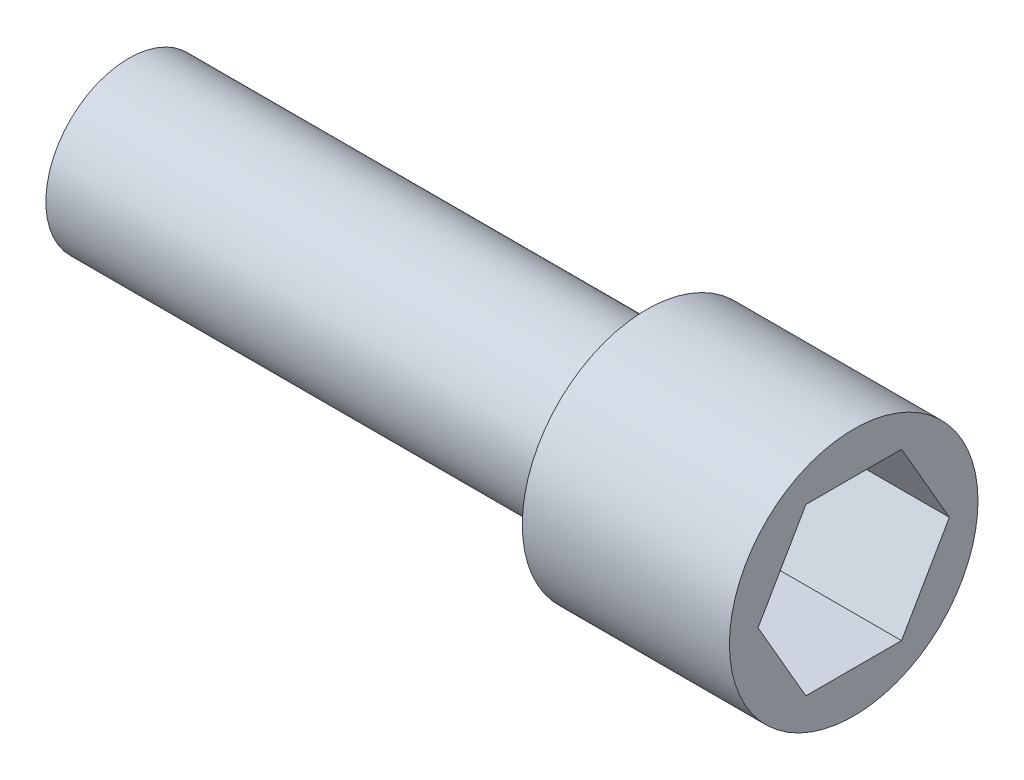
ISO-10303-21;
HEADER;
FILE_DESCRIPTION(('STEP AP214'),'2;1');
FILE_NAME('part.step','',(''),(''),'','','');
FILE_SCHEMA(('AUTOMOTIVE_DESIGN { 1 0 10303 214 1 1 1 1 }'));
ENDSEC;
DATA;
#1=APPLICATION_CONTEXT('core data for automotive mechanical design processes');
#2=APPLICATION_PROTOCOL_DEFINITION('international standard','automotive_design',2000,#1);
#3=PRODUCT_CONTEXT('',#1,'mechanical');
#4=PRODUCT('Part','Part','',(#3));
#5=PRODUCT_RELATED_PRODUCT_CATEGORY('part','',(#4));
#6=PRODUCT_DEFINITION_FORMATION('','',#4);
#7=PRODUCT_DEFINITION_CONTEXT('part definition',#1,'design');
#8=PRODUCT_DEFINITION('design','',#6,#7);
#9=PRODUCT_DEFINITION_SHAPE('','',#8);
#10=(LENGTH_UNIT() NAMED_UNIT(*) SI_UNIT(.MILLI.,.METRE.));
#11=(NAMED_UNIT(*) PLANE_ANGLE_UNIT() SI_UNIT($,.RADIAN.));
#12=(NAMED_UNIT(*) SI_UNIT($,.STERADIAN.) SOLID_ANGLE_UNIT());
#13=UNCERTAINTY_MEASURE_WITH_UNIT(LENGTH_MEASURE(1.E-05),#10,'distance_accuracy_value','');
#14=(GEOMETRIC_REPRESENTATION_CONTEXT(3) GLOBAL_UNCERTAINTY_ASSIGNED_CONTEXT((#13)) GLOBAL_UNIT_ASSIGNED_CONTEXT((#10,
#11,#12)) REPRESENTATION_CONTEXT('',''));
#15=CARTESIAN_POINT('',(0.,0.,0.));
#16=DIRECTION('',(0.,0.,1.));
#17=DIRECTION('',(1.,0.,0.));
#18=AXIS2_PLACEMENT_3D('',#15,#16,#17);
#19=CARTESIAN_POINT('',(0.,0.,0.));
#20=DIRECTION('',(-1.,0.,0.));
#21=DIRECTION('',(0.,0.,1.));
#22=AXIS2_PLACEMENT_3D('',#19,#20,#21);
#23=PLANE('',#22);
#24=CARTESIAN_POINT('',(0.,0.,0.));
#25=DIRECTION('',(1.,0.,0.));
#26=DIRECTION('',(0.,0.,-1.));
#27=AXIS2_PLACEMENT_3D('',#24,#25,#26);
#28=CIRCLE('',#27,4.);
#29=CARTESIAN_POINT('',(0.,0.,-4.));
#30=VERTEX_POINT('',#29);
#31=EDGE_CURVE('E11',#30,#30,#28,.T.);
#32=ORIENTED_EDGE('',*,*,#31,.F.);
#33=EDGE_LOOP('',(#32));
#34=FACE_BOUND('',#33,.T.);
#35=ADVANCED_FACE('F41',(#34),#23,.T.);
#36=CARTESIAN_POINT('',(35.,0.,0.));
#37=DIRECTION('',(1.,0.,0.));
#38=DIRECTION('',(0.,0.,-1.));
#39=AXIS2_PLACEMENT_3D('',#36,#37,#38);
#40=CYLINDRICAL_SURFACE('',#39,4.);
#41=ORIENTED_EDGE('',*,*,#31,.T.);
#42=EDGE_LOOP('',(#41));
#43=FACE_BOUND('',#42,.T.);
#44=CARTESIAN_POINT('',(25.,0.,0.));
#45=DIRECTION('',(1.,0.,0.));
#46=DIRECTION('',(0.,0.,-1.));
#47=AXIS2_PLACEMENT_3D('',#44,#45,#46);
#48=CIRCLE('',#47,4.);
#49=CARTESIAN_POINT('',(25.,0.,-4.));
#50=VERTEX_POINT('',#49);
#51=EDGE_CURVE('E48',#50,#50,#48,.T.);
#52=ORIENTED_EDGE('',*,*,#51,.F.);
#53=EDGE_LOOP('',(#52));
#54=FACE_BOUND('',#53,.T.);
#55=ADVANCED_FACE('F156',(#43,#54),#40,.T.);
#56=CARTESIAN_POINT('',(25.,4.,0.));
#57=DIRECTION('',(-1.,0.,0.));
#58=DIRECTION('',(0.,0.,1.));
#59=AXIS2_PLACEMENT_3D('',#56,#57,#58);
#60=PLANE('',#59);
#61=ORIENTED_EDGE('',*,*,#51,.T.);
#62=EDGE_LOOP('',(#61));
#63=FACE_BOUND('',#62,.T.);
#64=CARTESIAN_POINT('',(25.,0.,0.));
#65=DIRECTION('',(1.,0.,0.));
#66=DIRECTION('',(0.,0.,-1.));
#67=AXIS2_PLACEMENT_3D('',#64,#65,#66);
#68=CIRCLE('',#67,6.);
#69=CARTESIAN_POINT('',(25.,0.,-6.));
#70=VERTEX_POINT('',#69);
#71=EDGE_CURVE('E148',#70,#70,#68,.T.);
#72=ORIENTED_EDGE('',*,*,#71,.F.);
#73=EDGE_LOOP('',(#72));
#74=FACE_BOUND('',#73,.T.);
#75=ADVANCED_FACE('F154',(#63,#74),#60,.T.);
#76=CARTESIAN_POINT('',(35.,0.,0.));
#77=DIRECTION('',(1.,0.,0.));
#78=DIRECTION('',(0.,0.,-1.));
#79=AXIS2_PLACEMENT_3D('',#76,#77,#78);
#80=CYLINDRICAL_SURFACE('',#79,6.);
#81=ORIENTED_EDGE('',*,*,#71,.T.);
#82=EDGE_LOOP('',(#81));
#83=FACE_BOUND('',#82,.T.);
#84=CARTESIAN_POINT('',(35.,0.,0.));
#85=DIRECTION('',(1.,0.,0.));
#86=DIRECTION('',(0.,0.,-1.));
#87=AXIS2_PLACEMENT_3D('',#84,#85,#86);
#88=CIRCLE('',#87,6.);
#89=CARTESIAN_POINT('',(35.,0.,-6.));
#90=VERTEX_POINT('',#89);
#91=EDGE_CURVE('E145',#90,#90,#88,.T.);
#92=ORIENTED_EDGE('',*,*,#91,.F.);
#93=EDGE_LOOP('',(#92));
#94=FACE_BOUND('',#93,.T.);
#95=ADVANCED_FACE('F164',(#83,#94),#80,.T.);
#96=CARTESIAN_POINT('',(35.,6.,0.));
#97=DIRECTION('',(1.,0.,0.));
#98=DIRECTION('',(0.,0.,-1.));
#99=AXIS2_PLACEMENT_3D('',#96,#97,#98);
#100=PLANE('',#99);
#101=DIRECTION('',(0.,0.866025403784438,-0.5));
#102=VECTOR('',#101,1.);
#103=CARTESIAN_POINT('',(35.,-4.,-2.3094010767585));
#104=LINE('',#103,#102);
#105=CARTESIAN_POINT('',(35.,-4.,-2.3094010767585));
#106=VERTEX_POINT('',#105);
#107=CARTESIAN_POINT('',(35.,0.,-4.61880215351701));
#108=VERTEX_POINT('',#107);
#109=EDGE_CURVE('E54',#106,#108,#104,.T.);
#110=ORIENTED_EDGE('',*,*,#109,.F.);
#111=DIRECTION('',(0.,0.,-1.));
#112=VECTOR('',#111,1.);
#113=CARTESIAN_POINT('',(35.,-4.,2.3094010767585));
#114=LINE('',#113,#112);
#115=CARTESIAN_POINT('',(35.,-4.,2.3094010767585));
#116=VERTEX_POINT('',#115);
#117=EDGE_CURVE('E138',#116,#106,#114,.T.);
#118=ORIENTED_EDGE('',*,*,#117,.F.);
#119=DIRECTION('',(0.,-0.866025403784438,-0.5));
#120=VECTOR('',#119,1.);
#121=CARTESIAN_POINT('',(35.,0.,4.61880215351701));
#122=LINE('',#121,#120);
#123=CARTESIAN_POINT('',(35.,0.,4.61880215351701));
#124=VERTEX_POINT('',#123);
#125=EDGE_CURVE('E136',#124,#116,#122,.T.);
#126=ORIENTED_EDGE('',*,*,#125,.F.);
#127=DIRECTION('',(0.,-0.866025403784438,0.5));
#128=VECTOR('',#127,1.);
#129=CARTESIAN_POINT('',(35.,4.,2.3094010767585));
#130=LINE('',#129,#128);
#131=CARTESIAN_POINT('',(35.,4.,2.3094010767585));
#132=VERTEX_POINT('',#131);
#133=EDGE_CURVE('E104',#132,#124,#130,.T.);
#134=ORIENTED_EDGE('',*,*,#133,.F.);
#135=DIRECTION('',(0.,0.,1.));
#136=VECTOR('',#135,1.);
#137=CARTESIAN_POINT('',(35.,4.,-2.3094010767585));
#138=LINE('',#137,#136);
#139=CARTESIAN_POINT('',(35.,4.,-2.3094010767585));
#140=VERTEX_POINT('',#139);
#141=EDGE_CURVE('E135',#140,#132,#138,.T.);
#142=ORIENTED_EDGE('',*,*,#141,.F.);
#143=DIRECTION('',(0.,0.866025403784438,0.5));
#144=VECTOR('',#143,1.);
#145=CARTESIAN_POINT('',(35.,0.,-4.61880215351701));
#146=LINE('',#145,#144);
#147=EDGE_CURVE('E129',#108,#140,#146,.T.);
#148=ORIENTED_EDGE('',*,*,#147,.F.);
#149=EDGE_LOOP('',(#110,#118,#126,#134,#142,#148));
#150=FACE_BOUND('',#149,.T.);
#151=ORIENTED_EDGE('',*,*,#91,.T.);
#152=EDGE_LOOP('',(#151));
#153=FACE_BOUND('',#152,.T.);
#154=ADVANCED_FACE('F173',(#150,#153),#100,.T.);
#155=CARTESIAN_POINT('',(28.,-4.,-2.3094010767585));
#156=DIRECTION('',(0.,-0.5,-0.866025403784438));
#157=DIRECTION('',(0.,0.866025403784439,-0.5));
#158=AXIS2_PLACEMENT_3D('',#155,#156,#157);
#159=PLANE('',#158);
#160=ORIENTED_EDGE('',*,*,#109,.T.);
#161=DIRECTION('',(1.,0.,0.));
#162=VECTOR('',#161,1.);
#163=CARTESIAN_POINT('',(28.,0.,-4.61880215351701));
#164=LINE('',#163,#162);
#165=CARTESIAN_POINT('',(28.,0.,-4.61880215351701));
#166=VERTEX_POINT('',#165);
#167=EDGE_CURVE('E82',#166,#108,#164,.T.);
#168=ORIENTED_EDGE('',*,*,#167,.F.);
#169=DIRECTION('',(0.,0.866025403784438,-0.5));
#170=VECTOR('',#169,1.);
#171=CARTESIAN_POINT('',(28.,-4.,-2.3094010767585));
#172=LINE('',#171,#170);
#173=CARTESIAN_POINT('',(28.,-4.,-2.3094010767585));
#174=VERTEX_POINT('',#173);
#175=EDGE_CURVE('E139',#174,#166,#172,.T.);
#176=ORIENTED_EDGE('',*,*,#175,.F.);
#177=DIRECTION('',(1.,0.,0.));
#178=VECTOR('',#177,1.);
#179=CARTESIAN_POINT('',(28.,-4.,-2.3094010767585));
#180=LINE('',#179,#178);
#181=EDGE_CURVE('E61',#174,#106,#180,.T.);
#182=ORIENTED_EDGE('',*,*,#181,.T.);
#183=EDGE_LOOP('',(#160,#168,#176,#182));
#184=FACE_BOUND('',#183,.T.);
#185=ADVANCED_FACE('F172',(#184),#159,.F.);
#186=CARTESIAN_POINT('',(28.,-4.,2.3094010767585));
#187=DIRECTION('',(0.,-1.,0.));
#188=DIRECTION('',(0.,0.,-1.));
#189=AXIS2_PLACEMENT_3D('',#186,#187,#188);
#190=PLANE('',#189);
#191=ORIENTED_EDGE('',*,*,#117,.T.);
#192=ORIENTED_EDGE('',*,*,#181,.F.);
#193=DIRECTION('',(0.,0.,-1.));
#194=VECTOR('',#193,1.);
#195=CARTESIAN_POINT('',(28.,-4.,2.3094010767585));
#196=LINE('',#195,#194);
#197=CARTESIAN_POINT('',(28.,-4.,2.3094010767585));
#198=VERTEX_POINT('',#197);
#199=EDGE_CURVE('E113',#198,#174,#196,.T.);
#200=ORIENTED_EDGE('',*,*,#199,.F.);
#201=DIRECTION('',(1.,0.,0.));
#202=VECTOR('',#201,1.);
#203=CARTESIAN_POINT('',(28.,-4.,2.3094010767585));
#204=LINE('',#203,#202);
#205=EDGE_CURVE('E110',#198,#116,#204,.T.);
#206=ORIENTED_EDGE('',*,*,#205,.T.);
#207=EDGE_LOOP('',(#191,#192,#200,#206));
#208=FACE_BOUND('',#207,.T.);
#209=ADVANCED_FACE('F177',(#208),#190,.F.);
#210=CARTESIAN_POINT('',(28.,0.,4.61880215351701));
#211=DIRECTION('',(0.,-0.5,0.866025403784438));
#212=DIRECTION('',(0.,-0.866025403784439,-0.5));
#213=AXIS2_PLACEMENT_3D('',#210,#211,#212);
#214=PLANE('',#213);
#215=ORIENTED_EDGE('',*,*,#125,.T.);
#216=ORIENTED_EDGE('',*,*,#205,.F.);
#217=DIRECTION('',(0.,-0.866025403784438,-0.5));
#218=VECTOR('',#217,1.);
#219=CARTESIAN_POINT('',(28.,0.,4.61880215351701));
#220=LINE('',#219,#218);
#221=CARTESIAN_POINT('',(28.,0.,4.61880215351701));
#222=VERTEX_POINT('',#221);
#223=EDGE_CURVE('E112',#222,#198,#220,.T.);
#224=ORIENTED_EDGE('',*,*,#223,.F.);
#225=DIRECTION('',(1.,0.,0.));
#226=VECTOR('',#225,1.);
#227=CARTESIAN_POINT('',(28.,0.,4.61880215351701));
#228=LINE('',#227,#226);
#229=EDGE_CURVE('E96',#222,#124,#228,.T.);
#230=ORIENTED_EDGE('',*,*,#229,.T.);
#231=EDGE_LOOP('',(#215,#216,#224,#230));
#232=FACE_BOUND('',#231,.T.);
#233=ADVANCED_FACE('F115',(#232),#214,.F.);
#234=CARTESIAN_POINT('',(28.,4.,2.3094010767585));
#235=DIRECTION('',(0.,0.5,0.866025403784438));
#236=DIRECTION('',(0.,-0.866025403784439,0.5));
#237=AXIS2_PLACEMENT_3D('',#234,#235,#236);
#238=PLANE('',#237);
#239=ORIENTED_EDGE('',*,*,#133,.T.);
#240=ORIENTED_EDGE('',*,*,#229,.F.);
#241=DIRECTION('',(0.,-0.866025403784438,0.5));
#242=VECTOR('',#241,1.);
#243=CARTESIAN_POINT('',(28.,4.,2.3094010767585));
#244=LINE('',#243,#242);
#245=CARTESIAN_POINT('',(28.,4.,2.3094010767585));
#246=VERTEX_POINT('',#245);
#247=EDGE_CURVE('E99',#246,#222,#244,.T.);
#248=ORIENTED_EDGE('',*,*,#247,.F.);
#249=DIRECTION('',(1.,0.,0.));
#250=VECTOR('',#249,1.);
#251=CARTESIAN_POINT('',(28.,4.,2.3094010767585));
#252=LINE('',#251,#250);
#253=EDGE_CURVE('E106',#246,#132,#252,.T.);
#254=ORIENTED_EDGE('',*,*,#253,.T.);
#255=EDGE_LOOP('',(#239,#240,#248,#254));
#256=FACE_BOUND('',#255,.T.);
#257=ADVANCED_FACE('F97',(#256),#238,.F.);
#258=CARTESIAN_POINT('',(28.,4.,-2.3094010767585));
#259=DIRECTION('',(0.,1.,0.));
#260=DIRECTION('',(0.,0.,1.));
#261=AXIS2_PLACEMENT_3D('',#258,#259,#260);
#262=PLANE('',#261);
#263=ORIENTED_EDGE('',*,*,#141,.T.);
#264=ORIENTED_EDGE('',*,*,#253,.F.);
#265=DIRECTION('',(0.,0.,1.));
#266=VECTOR('',#265,1.);
#267=CARTESIAN_POINT('',(28.,4.,-2.3094010767585));
#268=LINE('',#267,#266);
#269=CARTESIAN_POINT('',(28.,4.,-2.3094010767585));
#270=VERTEX_POINT('',#269);
#271=EDGE_CURVE('E123',#270,#246,#268,.T.);
#272=ORIENTED_EDGE('',*,*,#271,.F.);
#273=DIRECTION('',(1.,0.,0.));
#274=VECTOR('',#273,1.);
#275=CARTESIAN_POINT('',(28.,4.,-2.3094010767585));
#276=LINE('',#275,#274);
#277=EDGE_CURVE('E144',#270,#140,#276,.T.);
#278=ORIENTED_EDGE('',*,*,#277,.T.);
#279=EDGE_LOOP('',(#263,#264,#272,#278));
#280=FACE_BOUND('',#279,.T.);
#281=ADVANCED_FACE('F183',(#280),#262,.F.);
#282=CARTESIAN_POINT('',(28.,0.,-4.61880215351701));
#283=DIRECTION('',(0.,0.5,-0.866025403784438));
#284=DIRECTION('',(0.,0.866025403784438,0.5));
#285=AXIS2_PLACEMENT_3D('',#282,#283,#284);
#286=PLANE('',#285);
#287=ORIENTED_EDGE('',*,*,#147,.T.);
#288=ORIENTED_EDGE('',*,*,#277,.F.);
#289=DIRECTION('',(0.,0.866025403784438,0.5));
#290=VECTOR('',#289,1.);
#291=CARTESIAN_POINT('',(28.,0.,-4.61880215351701));
#292=LINE('',#291,#290);
#293=EDGE_CURVE('E121',#166,#270,#292,.T.);
#294=ORIENTED_EDGE('',*,*,#293,.F.);
#295=ORIENTED_EDGE('',*,*,#167,.T.);
#296=EDGE_LOOP('',(#287,#288,#294,#295));
#297=FACE_BOUND('',#296,.T.);
#298=ADVANCED_FACE('F179',(#297),#286,.F.);
#299=CARTESIAN_POINT('',(28.,0.,0.));
#300=DIRECTION('',(1.,0.,0.));
#301=DIRECTION('',(0.,0.,-1.));
#302=AXIS2_PLACEMENT_3D('',#299,#300,#301);
#303=PLANE('',#302);
#304=ORIENTED_EDGE('',*,*,#175,.T.);
#305=ORIENTED_EDGE('',*,*,#293,.T.);
#306=ORIENTED_EDGE('',*,*,#271,.T.);
#307=ORIENTED_EDGE('',*,*,#247,.T.);
#308=ORIENTED_EDGE('',*,*,#223,.T.);
#309=ORIENTED_EDGE('',*,*,#199,.T.);
#310=EDGE_LOOP('',(#304,#305,#306,#307,#308,#309));
#311=FACE_BOUND('',#310,.T.);
#312=ADVANCED_FACE('F116',(#311),#303,.T.);
#313=CLOSED_SHELL('',(#35,#55,#75,#95,#154,#185,#209,#233,#257,#281,#298,#312));
#314=MANIFOLD_SOLID_BREP('B2',#313);
#315=ADVANCED_BREP_SHAPE_REPRESENTATION('',(#18,#314),#14);
#316=SHAPE_DEFINITION_REPRESENTATION(#9,#315);
ENDSEC;
END-ISO-10303-21;
